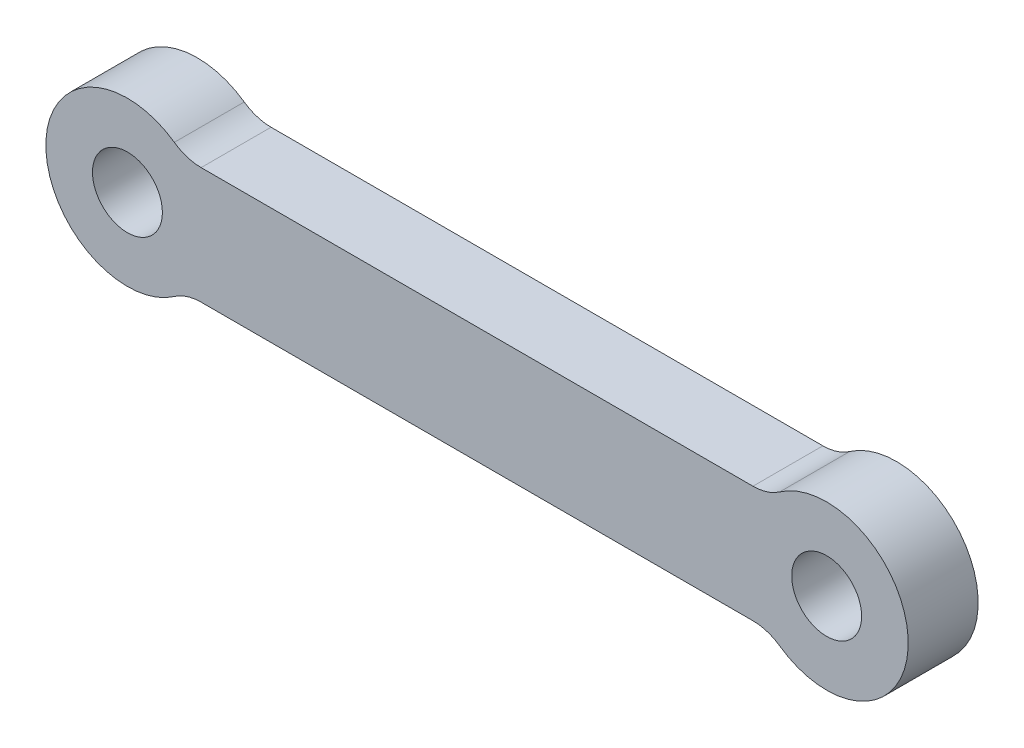
ISO-10303-21;
HEADER;
FILE_DESCRIPTION(('STEP AP214'),'2;1');
FILE_NAME('part.step','',(''),(''),'','','');
FILE_SCHEMA(('AUTOMOTIVE_DESIGN { 1 0 10303 214 1 1 1 1 }'));
ENDSEC;
DATA;
#1=APPLICATION_CONTEXT('core data for automotive mechanical design processes');
#2=APPLICATION_PROTOCOL_DEFINITION('international standard','automotive_design',2000,#1);
#3=PRODUCT_CONTEXT('',#1,'mechanical');
#4=PRODUCT('Part','Part','',(#3));
#5=PRODUCT_RELATED_PRODUCT_CATEGORY('part','',(#4));
#6=PRODUCT_DEFINITION_FORMATION('','',#4);
#7=PRODUCT_DEFINITION_CONTEXT('part definition',#1,'design');
#8=PRODUCT_DEFINITION('design','',#6,#7);
#9=PRODUCT_DEFINITION_SHAPE('','',#8);
#10=(LENGTH_UNIT() NAMED_UNIT(*) SI_UNIT(.MILLI.,.METRE.));
#11=(NAMED_UNIT(*) PLANE_ANGLE_UNIT() SI_UNIT($,.RADIAN.));
#12=(NAMED_UNIT(*) SI_UNIT($,.STERADIAN.) SOLID_ANGLE_UNIT());
#13=UNCERTAINTY_MEASURE_WITH_UNIT(LENGTH_MEASURE(1.E-05),#10,'distance_accuracy_value','');
#14=(GEOMETRIC_REPRESENTATION_CONTEXT(3) GLOBAL_UNCERTAINTY_ASSIGNED_CONTEXT((#13)) GLOBAL_UNIT_ASSIGNED_CONTEXT((#10,
#11,#12)) REPRESENTATION_CONTEXT('',''));
#15=CARTESIAN_POINT('',(0.,0.,0.));
#16=DIRECTION('',(0.,0.,1.));
#17=DIRECTION('',(1.,0.,0.));
#18=AXIS2_PLACEMENT_3D('',#15,#16,#17);
#19=CARTESIAN_POINT('',(26.8377223398316,-4.5,3.));
#20=DIRECTION('',(0.,0.,-1.));
#21=DIRECTION('',(-1.,0.,0.));
#22=AXIS2_PLACEMENT_3D('',#19,#20,#21);
#23=PLANE('',#22);
#24=CARTESIAN_POINT('',(26.8377223398316,-4.5,3.));
#25=DIRECTION('',(0.,0.,-1.));
#26=DIRECTION('',(-1.,0.,0.));
#27=AXIS2_PLACEMENT_3D('',#24,#25,#26);
#28=CIRCLE('',#27,2.);
#29=CARTESIAN_POINT('',(26.8377223398316,-2.5,3.));
#30=VERTEX_POINT('',#29);
#31=CARTESIAN_POINT('',(27.9876414889838,-2.86363636363636,3.));
#32=VERTEX_POINT('',#31);
#33=EDGE_CURVE('E146',#30,#32,#28,.T.);
#34=ORIENTED_EDGE('',*,*,#33,.T.);
#35=CARTESIAN_POINT('',(30.,0.,3.));
#36=DIRECTION('',(0.,0.,1.));
#37=DIRECTION('',(-1.,0.,0.));
#38=AXIS2_PLACEMENT_3D('',#35,#36,#37);
#39=CIRCLE('',#38,3.5);
#40=CARTESIAN_POINT('',(27.9876414889838,2.86363636363637,3.));
#41=VERTEX_POINT('',#40);
#42=EDGE_CURVE('E94',#32,#41,#39,.T.);
#43=ORIENTED_EDGE('',*,*,#42,.T.);
#44=CARTESIAN_POINT('',(26.8377223398316,4.5,3.));
#45=DIRECTION('',(0.,0.,-1.));
#46=DIRECTION('',(-1.,0.,0.));
#47=AXIS2_PLACEMENT_3D('',#44,#45,#46);
#48=CIRCLE('',#47,1.99999999999999);
#49=CARTESIAN_POINT('',(26.8377223398316,2.5,3.));
#50=VERTEX_POINT('',#49);
#51=EDGE_CURVE('E161',#41,#50,#48,.T.);
#52=ORIENTED_EDGE('',*,*,#51,.T.);
#53=DIRECTION('',(-1.,0.,0.));
#54=VECTOR('',#53,1.);
#55=CARTESIAN_POINT('',(3.16227766016838,2.5,3.));
#56=LINE('',#55,#54);
#57=CARTESIAN_POINT('',(3.16227766016838,2.5,3.));
#58=VERTEX_POINT('',#57);
#59=EDGE_CURVE('E174',#50,#58,#56,.T.);
#60=ORIENTED_EDGE('',*,*,#59,.T.);
#61=CARTESIAN_POINT('',(3.16227766016838,4.5,3.));
#62=DIRECTION('',(0.,0.,-1.));
#63=DIRECTION('',(-1.,0.,0.));
#64=AXIS2_PLACEMENT_3D('',#61,#62,#63);
#65=CIRCLE('',#64,2.);
#66=CARTESIAN_POINT('',(2.01235851101624,2.86363636363636,3.));
#67=VERTEX_POINT('',#66);
#68=EDGE_CURVE('E113',#58,#67,#65,.T.);
#69=ORIENTED_EDGE('',*,*,#68,.T.);
#70=CARTESIAN_POINT('',(0.,0.,3.));
#71=DIRECTION('',(0.,0.,1.));
#72=DIRECTION('',(1.,0.,0.));
#73=AXIS2_PLACEMENT_3D('',#70,#71,#72);
#74=CIRCLE('',#73,3.5);
#75=CARTESIAN_POINT('',(2.01235851101624,-2.86363636363636,3.));
#76=VERTEX_POINT('',#75);
#77=EDGE_CURVE('E107',#67,#76,#74,.T.);
#78=ORIENTED_EDGE('',*,*,#77,.T.);
#79=CARTESIAN_POINT('',(3.16227766016838,-4.5,3.));
#80=DIRECTION('',(0.,0.,-1.));
#81=DIRECTION('',(1.,0.,0.));
#82=AXIS2_PLACEMENT_3D('',#79,#80,#81);
#83=CIRCLE('',#82,2.);
#84=CARTESIAN_POINT('',(3.16227766016838,-2.5,3.));
#85=VERTEX_POINT('',#84);
#86=EDGE_CURVE('E111',#76,#85,#83,.T.);
#87=ORIENTED_EDGE('',*,*,#86,.T.);
#88=DIRECTION('',(1.,0.,0.));
#89=VECTOR('',#88,1.);
#90=CARTESIAN_POINT('',(3.16227766016838,-2.5,3.));
#91=LINE('',#90,#89);
#92=EDGE_CURVE('E51',#85,#30,#91,.T.);
#93=ORIENTED_EDGE('',*,*,#92,.T.);
#94=EDGE_LOOP('',(#34,#43,#52,#60,#69,#78,#87,#93));
#95=FACE_BOUND('',#94,.T.);
#96=CARTESIAN_POINT('',(0.,0.,3.));
#97=DIRECTION('',(0.,0.,1.));
#98=DIRECTION('',(1.,0.,0.));
#99=AXIS2_PLACEMENT_3D('',#96,#97,#98);
#100=CIRCLE('',#99,1.5);
#101=CARTESIAN_POINT('',(1.5,0.,3.));
#102=VERTEX_POINT('',#101);
#103=EDGE_CURVE('E135',#102,#102,#100,.T.);
#104=ORIENTED_EDGE('',*,*,#103,.F.);
#105=EDGE_LOOP('',(#104));
#106=FACE_BOUND('',#105,.T.);
#107=CARTESIAN_POINT('',(30.,0.,3.));
#108=DIRECTION('',(0.,0.,1.));
#109=DIRECTION('',(1.,0.,0.));
#110=AXIS2_PLACEMENT_3D('',#107,#108,#109);
#111=CIRCLE('',#110,1.5);
#112=CARTESIAN_POINT('',(31.5,0.,3.));
#113=VERTEX_POINT('',#112);
#114=EDGE_CURVE('E183',#113,#113,#111,.T.);
#115=ORIENTED_EDGE('',*,*,#114,.F.);
#116=EDGE_LOOP('',(#115));
#117=FACE_BOUND('',#116,.T.);
#118=ADVANCED_FACE('F34',(#95,#106,#117),#23,.F.);
#119=CARTESIAN_POINT('',(26.8377223398316,-4.5,0.));
#120=DIRECTION('',(0.,0.,-1.));
#121=DIRECTION('',(-1.,0.,0.));
#122=AXIS2_PLACEMENT_3D('',#119,#120,#121);
#123=PLANE('',#122);
#124=CARTESIAN_POINT('',(0.,0.,0.));
#125=DIRECTION('',(0.,0.,1.));
#126=DIRECTION('',(1.,0.,0.));
#127=AXIS2_PLACEMENT_3D('',#124,#125,#126);
#128=CIRCLE('',#127,1.5);
#129=CARTESIAN_POINT('',(1.5,0.,0.));
#130=VERTEX_POINT('',#129);
#131=EDGE_CURVE('E180',#130,#130,#128,.T.);
#132=ORIENTED_EDGE('',*,*,#131,.T.);
#133=EDGE_LOOP('',(#132));
#134=FACE_BOUND('',#133,.T.);
#135=CARTESIAN_POINT('',(26.8377223398316,-4.5,0.));
#136=DIRECTION('',(0.,0.,-1.));
#137=DIRECTION('',(-1.,0.,0.));
#138=AXIS2_PLACEMENT_3D('',#135,#136,#137);
#139=CIRCLE('',#138,2.);
#140=CARTESIAN_POINT('',(26.8377223398316,-2.5,0.));
#141=VERTEX_POINT('',#140);
#142=CARTESIAN_POINT('',(27.9876414889838,-2.86363636363636,0.));
#143=VERTEX_POINT('',#142);
#144=EDGE_CURVE('E131',#141,#143,#139,.T.);
#145=ORIENTED_EDGE('',*,*,#144,.F.);
#146=DIRECTION('',(1.,0.,0.));
#147=VECTOR('',#146,1.);
#148=CARTESIAN_POINT('',(3.16227766016838,-2.5,0.));
#149=LINE('',#148,#147);
#150=CARTESIAN_POINT('',(3.16227766016838,-2.5,0.));
#151=VERTEX_POINT('',#150);
#152=EDGE_CURVE('E86',#151,#141,#149,.T.);
#153=ORIENTED_EDGE('',*,*,#152,.F.);
#154=CARTESIAN_POINT('',(3.16227766016838,-4.5,0.));
#155=DIRECTION('',(0.,0.,-1.));
#156=DIRECTION('',(1.,0.,0.));
#157=AXIS2_PLACEMENT_3D('',#154,#155,#156);
#158=CIRCLE('',#157,2.);
#159=CARTESIAN_POINT('',(2.01235851101624,-2.86363636363636,0.));
#160=VERTEX_POINT('',#159);
#161=EDGE_CURVE('E80',#160,#151,#158,.T.);
#162=ORIENTED_EDGE('',*,*,#161,.F.);
#163=CARTESIAN_POINT('',(0.,0.,0.));
#164=DIRECTION('',(0.,0.,1.));
#165=DIRECTION('',(1.,0.,0.));
#166=AXIS2_PLACEMENT_3D('',#163,#164,#165);
#167=CIRCLE('',#166,3.5);
#168=CARTESIAN_POINT('',(2.01235851101624,2.86363636363636,0.));
#169=VERTEX_POINT('',#168);
#170=EDGE_CURVE('E121',#169,#160,#167,.T.);
#171=ORIENTED_EDGE('',*,*,#170,.F.);
#172=CARTESIAN_POINT('',(3.16227766016838,4.5,0.));
#173=DIRECTION('',(0.,0.,-1.));
#174=DIRECTION('',(-1.,0.,0.));
#175=AXIS2_PLACEMENT_3D('',#172,#173,#174);
#176=CIRCLE('',#175,2.);
#177=CARTESIAN_POINT('',(3.16227766016838,2.5,0.));
#178=VERTEX_POINT('',#177);
#179=EDGE_CURVE('E141',#178,#169,#176,.T.);
#180=ORIENTED_EDGE('',*,*,#179,.F.);
#181=DIRECTION('',(-1.,0.,0.));
#182=VECTOR('',#181,1.);
#183=CARTESIAN_POINT('',(3.16227766016838,2.5,0.));
#184=LINE('',#183,#182);
#185=CARTESIAN_POINT('',(26.8377223398316,2.5,0.));
#186=VERTEX_POINT('',#185);
#187=EDGE_CURVE('E139',#186,#178,#184,.T.);
#188=ORIENTED_EDGE('',*,*,#187,.F.);
#189=CARTESIAN_POINT('',(26.8377223398316,4.5,0.));
#190=DIRECTION('',(0.,0.,-1.));
#191=DIRECTION('',(-1.,0.,0.));
#192=AXIS2_PLACEMENT_3D('',#189,#190,#191);
#193=CIRCLE('',#192,1.99999999999999);
#194=CARTESIAN_POINT('',(27.9876414889838,2.86363636363637,0.));
#195=VERTEX_POINT('',#194);
#196=EDGE_CURVE('E137',#195,#186,#193,.T.);
#197=ORIENTED_EDGE('',*,*,#196,.F.);
#198=CARTESIAN_POINT('',(30.,0.,0.));
#199=DIRECTION('',(0.,0.,1.));
#200=DIRECTION('',(-1.,0.,0.));
#201=AXIS2_PLACEMENT_3D('',#198,#199,#200);
#202=CIRCLE('',#201,3.5);
#203=EDGE_CURVE('E134',#143,#195,#202,.T.);
#204=ORIENTED_EDGE('',*,*,#203,.F.);
#205=EDGE_LOOP('',(#145,#153,#162,#171,#180,#188,#197,#204));
#206=FACE_BOUND('',#205,.T.);
#207=CARTESIAN_POINT('',(30.,0.,0.));
#208=DIRECTION('',(0.,0.,1.));
#209=DIRECTION('',(1.,0.,0.));
#210=AXIS2_PLACEMENT_3D('',#207,#208,#209);
#211=CIRCLE('',#210,1.5);
#212=CARTESIAN_POINT('',(31.5,0.,0.));
#213=VERTEX_POINT('',#212);
#214=EDGE_CURVE('E186',#213,#213,#211,.T.);
#215=ORIENTED_EDGE('',*,*,#214,.T.);
#216=EDGE_LOOP('',(#215));
#217=FACE_BOUND('',#216,.T.);
#218=ADVANCED_FACE('F165',(#134,#206,#217),#123,.T.);
#219=CARTESIAN_POINT('',(26.8377223398316,-4.5,3.));
#220=DIRECTION('',(0.,0.,-1.));
#221=DIRECTION('',(-1.,0.,0.));
#222=AXIS2_PLACEMENT_3D('',#219,#220,#221);
#223=CYLINDRICAL_SURFACE('',#222,2.);
#224=ORIENTED_EDGE('',*,*,#144,.T.);
#225=DIRECTION('',(0.,0.,-1.));
#226=VECTOR('',#225,1.);
#227=CARTESIAN_POINT('',(27.9876414889838,-2.86363636363636,3.));
#228=LINE('',#227,#226);
#229=EDGE_CURVE('E11',#32,#143,#228,.T.);
#230=ORIENTED_EDGE('',*,*,#229,.F.);
#231=ORIENTED_EDGE('',*,*,#33,.F.);
#232=DIRECTION('',(0.,0.,-1.));
#233=VECTOR('',#232,1.);
#234=CARTESIAN_POINT('',(26.8377223398316,-2.5,3.));
#235=LINE('',#234,#233);
#236=EDGE_CURVE('E127',#30,#141,#235,.T.);
#237=ORIENTED_EDGE('',*,*,#236,.T.);
#238=EDGE_LOOP('',(#224,#230,#231,#237));
#239=FACE_BOUND('',#238,.T.);
#240=ADVANCED_FACE('F36',(#239),#223,.F.);
#241=CARTESIAN_POINT('',(30.,0.,3.));
#242=DIRECTION('',(0.,0.,-1.));
#243=DIRECTION('',(-1.,0.,0.));
#244=AXIS2_PLACEMENT_3D('',#241,#242,#243);
#245=CYLINDRICAL_SURFACE('',#244,3.5);
#246=ORIENTED_EDGE('',*,*,#203,.T.);
#247=DIRECTION('',(0.,0.,-1.));
#248=VECTOR('',#247,1.);
#249=CARTESIAN_POINT('',(27.9876414889838,2.86363636363637,3.));
#250=LINE('',#249,#248);
#251=EDGE_CURVE('E43',#41,#195,#250,.T.);
#252=ORIENTED_EDGE('',*,*,#251,.F.);
#253=ORIENTED_EDGE('',*,*,#42,.F.);
#254=ORIENTED_EDGE('',*,*,#229,.T.);
#255=EDGE_LOOP('',(#246,#252,#253,#254));
#256=FACE_BOUND('',#255,.T.);
#257=ADVANCED_FACE('F218',(#256),#245,.T.);
#258=CARTESIAN_POINT('',(26.8377223398316,4.5,3.));
#259=DIRECTION('',(0.,0.,-1.));
#260=DIRECTION('',(-1.,0.,0.));
#261=AXIS2_PLACEMENT_3D('',#258,#259,#260);
#262=CYLINDRICAL_SURFACE('',#261,1.99999999999999);
#263=ORIENTED_EDGE('',*,*,#196,.T.);
#264=DIRECTION('',(0.,0.,-1.));
#265=VECTOR('',#264,1.);
#266=CARTESIAN_POINT('',(26.8377223398316,2.5,3.));
#267=LINE('',#266,#265);
#268=EDGE_CURVE('E153',#50,#186,#267,.T.);
#269=ORIENTED_EDGE('',*,*,#268,.F.);
#270=ORIENTED_EDGE('',*,*,#51,.F.);
#271=ORIENTED_EDGE('',*,*,#251,.T.);
#272=EDGE_LOOP('',(#263,#269,#270,#271));
#273=FACE_BOUND('',#272,.T.);
#274=ADVANCED_FACE('F159',(#273),#262,.F.);
#275=CARTESIAN_POINT('',(3.16227766016838,2.5,3.));
#276=DIRECTION('',(0.,-1.,0.));
#277=DIRECTION('',(1.,0.,0.));
#278=AXIS2_PLACEMENT_3D('',#275,#276,#277);
#279=PLANE('',#278);
#280=ORIENTED_EDGE('',*,*,#187,.T.);
#281=DIRECTION('',(0.,0.,-1.));
#282=VECTOR('',#281,1.);
#283=CARTESIAN_POINT('',(3.16227766016838,2.5,3.));
#284=LINE('',#283,#282);
#285=EDGE_CURVE('E150',#58,#178,#284,.T.);
#286=ORIENTED_EDGE('',*,*,#285,.F.);
#287=ORIENTED_EDGE('',*,*,#59,.F.);
#288=ORIENTED_EDGE('',*,*,#268,.T.);
#289=EDGE_LOOP('',(#280,#286,#287,#288));
#290=FACE_BOUND('',#289,.T.);
#291=ADVANCED_FACE('F170',(#290),#279,.F.);
#292=CARTESIAN_POINT('',(3.16227766016838,4.5,3.));
#293=DIRECTION('',(0.,0.,-1.));
#294=DIRECTION('',(-1.,0.,0.));
#295=AXIS2_PLACEMENT_3D('',#292,#293,#294);
#296=CYLINDRICAL_SURFACE('',#295,2.);
#297=ORIENTED_EDGE('',*,*,#179,.T.);
#298=DIRECTION('',(0.,0.,-1.));
#299=VECTOR('',#298,1.);
#300=CARTESIAN_POINT('',(2.01235851101624,2.86363636363636,3.));
#301=LINE('',#300,#299);
#302=EDGE_CURVE('E122',#67,#169,#301,.T.);
#303=ORIENTED_EDGE('',*,*,#302,.F.);
#304=ORIENTED_EDGE('',*,*,#68,.F.);
#305=ORIENTED_EDGE('',*,*,#285,.T.);
#306=EDGE_LOOP('',(#297,#303,#304,#305));
#307=FACE_BOUND('',#306,.T.);
#308=ADVANCED_FACE('F173',(#307),#296,.F.);
#309=CARTESIAN_POINT('',(0.,0.,3.));
#310=DIRECTION('',(0.,0.,-1.));
#311=DIRECTION('',(-1.,0.,0.));
#312=AXIS2_PLACEMENT_3D('',#309,#310,#311);
#313=CYLINDRICAL_SURFACE('',#312,3.5);
#314=ORIENTED_EDGE('',*,*,#170,.T.);
#315=DIRECTION('',(0.,0.,-1.));
#316=VECTOR('',#315,1.);
#317=CARTESIAN_POINT('',(2.01235851101624,-2.86363636363636,3.));
#318=LINE('',#317,#316);
#319=EDGE_CURVE('E118',#76,#160,#318,.T.);
#320=ORIENTED_EDGE('',*,*,#319,.F.);
#321=ORIENTED_EDGE('',*,*,#77,.F.);
#322=ORIENTED_EDGE('',*,*,#302,.T.);
#323=EDGE_LOOP('',(#314,#320,#321,#322));
#324=FACE_BOUND('',#323,.T.);
#325=ADVANCED_FACE('F119',(#324),#313,.T.);
#326=CARTESIAN_POINT('',(3.16227766016838,-4.5,3.));
#327=DIRECTION('',(0.,0.,-1.));
#328=DIRECTION('',(-1.,0.,0.));
#329=AXIS2_PLACEMENT_3D('',#326,#327,#328);
#330=CYLINDRICAL_SURFACE('',#329,2.);
#331=ORIENTED_EDGE('',*,*,#161,.T.);
#332=DIRECTION('',(0.,0.,-1.));
#333=VECTOR('',#332,1.);
#334=CARTESIAN_POINT('',(3.16227766016838,-2.5,3.));
#335=LINE('',#334,#333);
#336=EDGE_CURVE('E123',#85,#151,#335,.T.);
#337=ORIENTED_EDGE('',*,*,#336,.F.);
#338=ORIENTED_EDGE('',*,*,#86,.F.);
#339=ORIENTED_EDGE('',*,*,#319,.T.);
#340=EDGE_LOOP('',(#331,#337,#338,#339));
#341=FACE_BOUND('',#340,.T.);
#342=ADVANCED_FACE('F125',(#341),#330,.F.);
#343=CARTESIAN_POINT('',(3.16227766016838,-2.5,3.));
#344=DIRECTION('',(0.,1.,0.));
#345=DIRECTION('',(-1.,0.,0.));
#346=AXIS2_PLACEMENT_3D('',#343,#344,#345);
#347=PLANE('',#346);
#348=ORIENTED_EDGE('',*,*,#152,.T.);
#349=ORIENTED_EDGE('',*,*,#236,.F.);
#350=ORIENTED_EDGE('',*,*,#92,.F.);
#351=ORIENTED_EDGE('',*,*,#336,.T.);
#352=EDGE_LOOP('',(#348,#349,#350,#351));
#353=FACE_BOUND('',#352,.T.);
#354=ADVANCED_FACE('F206',(#353),#347,.F.);
#355=CARTESIAN_POINT('',(0.,0.,3.));
#356=DIRECTION('',(0.,0.,-1.));
#357=DIRECTION('',(-1.,0.,0.));
#358=AXIS2_PLACEMENT_3D('',#355,#356,#357);
#359=CYLINDRICAL_SURFACE('',#358,1.5);
#360=ORIENTED_EDGE('',*,*,#103,.T.);
#361=EDGE_LOOP('',(#360));
#362=FACE_BOUND('',#361,.T.);
#363=ORIENTED_EDGE('',*,*,#131,.F.);
#364=EDGE_LOOP('',(#363));
#365=FACE_BOUND('',#364,.T.);
#366=ADVANCED_FACE('F203',(#362,#365),#359,.F.);
#367=CARTESIAN_POINT('',(30.,0.,3.));
#368=DIRECTION('',(0.,0.,-1.));
#369=DIRECTION('',(-1.,0.,0.));
#370=AXIS2_PLACEMENT_3D('',#367,#368,#369);
#371=CYLINDRICAL_SURFACE('',#370,1.5);
#372=ORIENTED_EDGE('',*,*,#114,.T.);
#373=EDGE_LOOP('',(#372));
#374=FACE_BOUND('',#373,.T.);
#375=ORIENTED_EDGE('',*,*,#214,.F.);
#376=EDGE_LOOP('',(#375));
#377=FACE_BOUND('',#376,.T.);
#378=ADVANCED_FACE('F192',(#374,#377),#371,.F.);
#379=CLOSED_SHELL('',(#118,#218,#240,#257,#274,#291,#308,#325,#342,#354,#366,#378));
#380=MANIFOLD_SOLID_BREP('B2',#379);
#381=ADVANCED_BREP_SHAPE_REPRESENTATION('',(#18,#380),#14);
#382=SHAPE_DEFINITION_REPRESENTATION(#9,#381);
ENDSEC;
END-ISO-10303-21;
